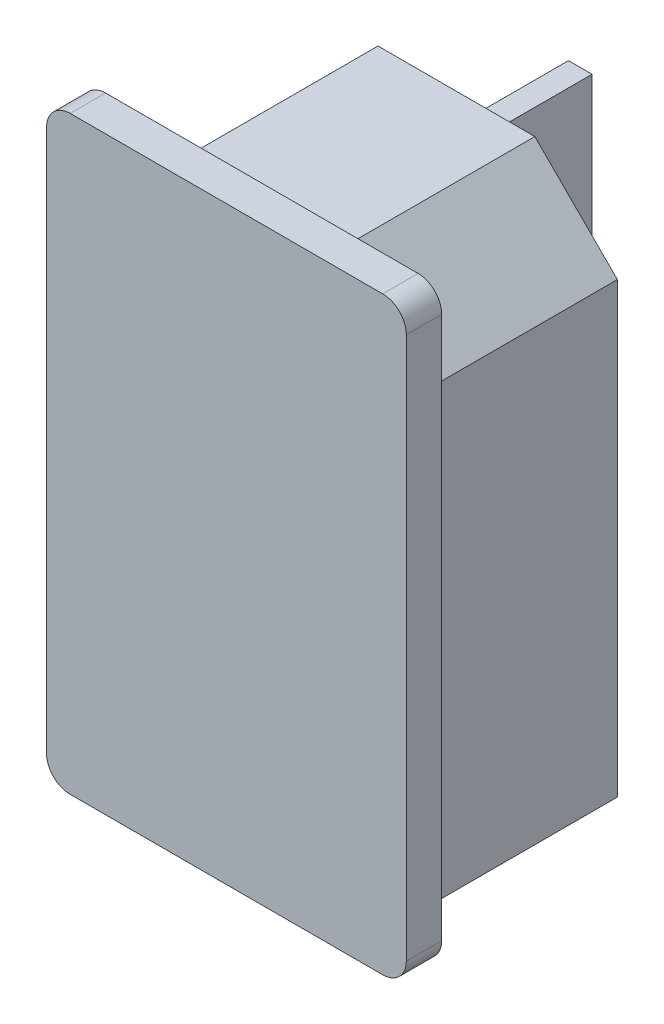
ISO-10303-21;
HEADER;
FILE_DESCRIPTION(('STEP AP214'),'2;1');
FILE_NAME('part.step','',(''),(''),'','','');
FILE_SCHEMA(('AUTOMOTIVE_DESIGN { 1 0 10303 214 1 1 1 1 }'));
ENDSEC;
DATA;
#1=APPLICATION_CONTEXT('core data for automotive mechanical design processes');
#2=APPLICATION_PROTOCOL_DEFINITION('international standard','automotive_design',2000,#1);
#3=PRODUCT_CONTEXT('',#1,'mechanical');
#4=PRODUCT('Part','Part','',(#3));
#5=PRODUCT_RELATED_PRODUCT_CATEGORY('part','',(#4));
#6=PRODUCT_DEFINITION_FORMATION('','',#4);
#7=PRODUCT_DEFINITION_CONTEXT('part definition',#1,'design');
#8=PRODUCT_DEFINITION('design','',#6,#7);
#9=PRODUCT_DEFINITION_SHAPE('','',#8);
#10=(LENGTH_UNIT() NAMED_UNIT(*) SI_UNIT(.MILLI.,.METRE.));
#11=(NAMED_UNIT(*) PLANE_ANGLE_UNIT() SI_UNIT($,.RADIAN.));
#12=(NAMED_UNIT(*) SI_UNIT($,.STERADIAN.) SOLID_ANGLE_UNIT());
#13=UNCERTAINTY_MEASURE_WITH_UNIT(LENGTH_MEASURE(1.E-05),#10,'distance_accuracy_value','');
#14=(GEOMETRIC_REPRESENTATION_CONTEXT(3) GLOBAL_UNCERTAINTY_ASSIGNED_CONTEXT((#13)) GLOBAL_UNIT_ASSIGNED_CONTEXT((#10,
#11,#12)) REPRESENTATION_CONTEXT('',''));
#15=CARTESIAN_POINT('',(0.,0.,0.));
#16=DIRECTION('',(0.,0.,1.));
#17=DIRECTION('',(1.,0.,0.));
#18=AXIS2_PLACEMENT_3D('',#15,#16,#17);
#19=CARTESIAN_POINT('',(0.,0.,-19.5));
#20=DIRECTION('',(0.,0.,-1.));
#21=DIRECTION('',(-1.,0.,0.));
#22=AXIS2_PLACEMENT_3D('',#19,#20,#21);
#23=PLANE('',#22);
#24=DIRECTION('',(0.,-1.,0.));
#25=VECTOR('',#24,1.);
#26=CARTESIAN_POINT('',(13.65,16.5,-19.5));
#27=LINE('',#26,#25);
#28=CARTESIAN_POINT('',(13.65,16.5,-19.5));
#29=VERTEX_POINT('',#28);
#30=CARTESIAN_POINT('',(13.65,-21.5,-19.5));
#31=VERTEX_POINT('',#30);
#32=EDGE_CURVE('E217',#29,#31,#27,.T.);
#33=ORIENTED_EDGE('',*,*,#32,.T.);
#34=DIRECTION('',(0.707106781186548,0.707106781186548,0.));
#35=VECTOR('',#34,1.);
#36=CARTESIAN_POINT('',(17.575,-17.575,-19.5));
#37=LINE('',#36,#35);
#38=CARTESIAN_POINT('',(11.65,-23.5,-19.5));
#39=VERTEX_POINT('',#38);
#40=EDGE_CURVE('E318',#31,#39,#37,.F.);
#41=ORIENTED_EDGE('',*,*,#40,.T.);
#42=DIRECTION('',(-1.,0.,0.));
#43=VECTOR('',#42,1.);
#44=CARTESIAN_POINT('',(13.65,-23.5,-19.5));
#45=LINE('',#44,#43);
#46=CARTESIAN_POINT('',(-11.65,-23.5,-19.5));
#47=VERTEX_POINT('',#46);
#48=EDGE_CURVE('E220',#39,#47,#45,.T.);
#49=ORIENTED_EDGE('',*,*,#48,.T.);
#50=DIRECTION('',(0.707106781186548,-0.707106781186547,0.));
#51=VECTOR('',#50,1.);
#52=CARTESIAN_POINT('',(-17.575,-17.575,-19.5));
#53=LINE('',#52,#51);
#54=CARTESIAN_POINT('',(-13.65,-21.5,-19.5));
#55=VERTEX_POINT('',#54);
#56=EDGE_CURVE('E316',#47,#55,#53,.F.);
#57=ORIENTED_EDGE('',*,*,#56,.T.);
#58=DIRECTION('',(0.,1.,0.));
#59=VECTOR('',#58,1.);
#60=CARTESIAN_POINT('',(-13.65,16.5,-19.5));
#61=LINE('',#60,#59);
#62=CARTESIAN_POINT('',(-13.65,16.5,-19.5));
#63=VERTEX_POINT('',#62);
#64=EDGE_CURVE('E208',#55,#63,#61,.T.);
#65=ORIENTED_EDGE('',*,*,#64,.T.);
#66=DIRECTION('',(0.707106781186548,0.707106781186547,0.));
#67=VECTOR('',#66,1.);
#68=CARTESIAN_POINT('',(-13.65,16.5,-19.5));
#69=LINE('',#68,#67);
#70=CARTESIAN_POINT('',(-6.65,23.5,-19.5));
#71=VERTEX_POINT('',#70);
#72=EDGE_CURVE('E210',#63,#71,#69,.T.);
#73=ORIENTED_EDGE('',*,*,#72,.T.);
#74=DIRECTION('',(1.,0.,0.));
#75=VECTOR('',#74,1.);
#76=CARTESIAN_POINT('',(6.65,23.5,-19.5));
#77=LINE('',#76,#75);
#78=CARTESIAN_POINT('',(6.65,23.5,-19.5));
#79=VERTEX_POINT('',#78);
#80=EDGE_CURVE('E213',#71,#79,#77,.T.);
#81=ORIENTED_EDGE('',*,*,#80,.T.);
#82=DIRECTION('',(0.707106781186548,-0.707106781186548,0.));
#83=VECTOR('',#82,1.);
#84=CARTESIAN_POINT('',(13.65,16.5,-19.5));
#85=LINE('',#84,#83);
#86=EDGE_CURVE('E215',#79,#29,#85,.T.);
#87=ORIENTED_EDGE('',*,*,#86,.T.);
#88=EDGE_LOOP('',(#33,#41,#49,#57,#65,#73,#81,#87));
#89=FACE_BOUND('',#88,.T.);
#90=DIRECTION('',(-1.,0.,0.));
#91=VECTOR('',#90,1.);
#92=CARTESIAN_POINT('',(1.,-20.,-19.5));
#93=LINE('',#92,#91);
#94=CARTESIAN_POINT('',(1.,-20.,-19.5));
#95=VERTEX_POINT('',#94);
#96=CARTESIAN_POINT('',(-1.,-20.,-19.5));
#97=VERTEX_POINT('',#96);
#98=EDGE_CURVE('E204',#95,#97,#93,.T.);
#99=ORIENTED_EDGE('',*,*,#98,.F.);
#100=DIRECTION('',(0.,-1.,0.));
#101=VECTOR('',#100,1.);
#102=CARTESIAN_POINT('',(1.,20.,-19.5));
#103=LINE('',#102,#101);
#104=CARTESIAN_POINT('',(1.,20.,-19.5));
#105=VERTEX_POINT('',#104);
#106=EDGE_CURVE('E198',#105,#95,#103,.T.);
#107=ORIENTED_EDGE('',*,*,#106,.F.);
#108=DIRECTION('',(1.,0.,0.));
#109=VECTOR('',#108,1.);
#110=CARTESIAN_POINT('',(1.,20.,-19.5));
#111=LINE('',#110,#109);
#112=CARTESIAN_POINT('',(-1.,20.,-19.5));
#113=VERTEX_POINT('',#112);
#114=EDGE_CURVE('E178',#113,#105,#111,.T.);
#115=ORIENTED_EDGE('',*,*,#114,.F.);
#116=DIRECTION('',(0.,1.,0.));
#117=VECTOR('',#116,1.);
#118=CARTESIAN_POINT('',(-1.,20.,-19.5));
#119=LINE('',#118,#117);
#120=EDGE_CURVE('E51',#97,#113,#119,.T.);
#121=ORIENTED_EDGE('',*,*,#120,.F.);
#122=EDGE_LOOP('',(#99,#107,#115,#121));
#123=FACE_BOUND('',#122,.T.);
#124=ADVANCED_FACE('F36',(#89,#123),#23,.T.);
#125=CARTESIAN_POINT('',(13.25,23.,-3.));
#126=DIRECTION('',(0.,0.,-1.));
#127=DIRECTION('',(-1.,0.,0.));
#128=AXIS2_PLACEMENT_3D('',#125,#126,#127);
#129=PLANE('',#128);
#130=CARTESIAN_POINT('',(13.25,23.,-3.));
#131=DIRECTION('',(0.,0.,1.));
#132=DIRECTION('',(-1.,0.,0.));
#133=AXIS2_PLACEMENT_3D('',#130,#131,#132);
#134=CIRCLE('',#133,2.);
#135=CARTESIAN_POINT('',(15.25,23.,-3.));
#136=VERTEX_POINT('',#135);
#137=CARTESIAN_POINT('',(13.25,25.,-3.));
#138=VERTEX_POINT('',#137);
#139=EDGE_CURVE('E246',#136,#138,#134,.T.);
#140=ORIENTED_EDGE('',*,*,#139,.F.);
#141=DIRECTION('',(0.,1.,0.));
#142=VECTOR('',#141,1.);
#143=CARTESIAN_POINT('',(15.25,23.,-3.));
#144=LINE('',#143,#142);
#145=CARTESIAN_POINT('',(15.25,-23.,-3.));
#146=VERTEX_POINT('',#145);
#147=EDGE_CURVE('E268',#146,#136,#144,.T.);
#148=ORIENTED_EDGE('',*,*,#147,.F.);
#149=CARTESIAN_POINT('',(13.25,-23.,-3.));
#150=DIRECTION('',(0.,0.,1.));
#151=DIRECTION('',(1.,0.,0.));
#152=AXIS2_PLACEMENT_3D('',#149,#150,#151);
#153=CIRCLE('',#152,2.);
#154=CARTESIAN_POINT('',(13.25,-25.,-3.));
#155=VERTEX_POINT('',#154);
#156=EDGE_CURVE('E265',#155,#146,#153,.T.);
#157=ORIENTED_EDGE('',*,*,#156,.F.);
#158=DIRECTION('',(1.,0.,0.));
#159=VECTOR('',#158,1.);
#160=CARTESIAN_POINT('',(-13.25,-25.,-3.));
#161=LINE('',#160,#159);
#162=CARTESIAN_POINT('',(-13.25,-25.,-3.));
#163=VERTEX_POINT('',#162);
#164=EDGE_CURVE('E262',#163,#155,#161,.T.);
#165=ORIENTED_EDGE('',*,*,#164,.F.);
#166=CARTESIAN_POINT('',(-13.25,-23.,-3.));
#167=DIRECTION('',(0.,0.,1.));
#168=DIRECTION('',(1.,0.,0.));
#169=AXIS2_PLACEMENT_3D('',#166,#167,#168);
#170=CIRCLE('',#169,2.);
#171=CARTESIAN_POINT('',(-15.25,-23.,-3.));
#172=VERTEX_POINT('',#171);
#173=EDGE_CURVE('E259',#172,#163,#170,.T.);
#174=ORIENTED_EDGE('',*,*,#173,.F.);
#175=DIRECTION('',(0.,-1.,0.));
#176=VECTOR('',#175,1.);
#177=CARTESIAN_POINT('',(-15.25,23.,-3.));
#178=LINE('',#177,#176);
#179=CARTESIAN_POINT('',(-15.25,23.,-3.));
#180=VERTEX_POINT('',#179);
#181=EDGE_CURVE('E256',#180,#172,#178,.T.);
#182=ORIENTED_EDGE('',*,*,#181,.F.);
#183=CARTESIAN_POINT('',(-13.25,23.,-3.));
#184=DIRECTION('',(0.,0.,1.));
#185=DIRECTION('',(1.,0.,0.));
#186=AXIS2_PLACEMENT_3D('',#183,#184,#185);
#187=CIRCLE('',#186,2.);
#188=CARTESIAN_POINT('',(-13.25,25.,-3.));
#189=VERTEX_POINT('',#188);
#190=EDGE_CURVE('E253',#189,#180,#187,.T.);
#191=ORIENTED_EDGE('',*,*,#190,.F.);
#192=DIRECTION('',(-1.,0.,0.));
#193=VECTOR('',#192,1.);
#194=CARTESIAN_POINT('',(-13.25,25.,-3.));
#195=LINE('',#194,#193);
#196=EDGE_CURVE('E249',#138,#189,#195,.T.);
#197=ORIENTED_EDGE('',*,*,#196,.F.);
#198=EDGE_LOOP('',(#140,#148,#157,#165,#174,#182,#191,#197));
#199=FACE_BOUND('',#198,.T.);
#200=DIRECTION('',(0.707106781186548,0.707106781186547,0.));
#201=VECTOR('',#200,1.);
#202=CARTESIAN_POINT('',(-13.65,16.5,-3.));
#203=LINE('',#202,#201);
#204=CARTESIAN_POINT('',(-13.65,16.5,-3.));
#205=VERTEX_POINT('',#204);
#206=CARTESIAN_POINT('',(-6.65,23.5,-3.));
#207=VERTEX_POINT('',#206);
#208=EDGE_CURVE('E194',#205,#207,#203,.T.);
#209=ORIENTED_EDGE('',*,*,#208,.F.);
#210=DIRECTION('',(0.,1.,0.));
#211=VECTOR('',#210,1.);
#212=CARTESIAN_POINT('',(-13.65,16.5,-3.));
#213=LINE('',#212,#211);
#214=CARTESIAN_POINT('',(-13.65,-21.5,-3.));
#215=VERTEX_POINT('',#214);
#216=EDGE_CURVE('E192',#215,#205,#213,.T.);
#217=ORIENTED_EDGE('',*,*,#216,.F.);
#218=DIRECTION('',(-0.707106781186548,0.707106781186547,0.));
#219=VECTOR('',#218,1.);
#220=CARTESIAN_POINT('',(-13.65,-21.5,-3.));
#221=LINE('',#220,#219);
#222=CARTESIAN_POINT('',(-11.65,-23.5,-3.));
#223=VERTEX_POINT('',#222);
#224=EDGE_CURVE('E12',#215,#223,#221,.F.);
#225=ORIENTED_EDGE('',*,*,#224,.T.);
#226=DIRECTION('',(-1.,0.,0.));
#227=VECTOR('',#226,1.);
#228=CARTESIAN_POINT('',(13.65,-23.5,-3.));
#229=LINE('',#228,#227);
#230=CARTESIAN_POINT('',(11.65,-23.5,-3.));
#231=VERTEX_POINT('',#230);
#232=EDGE_CURVE('E211',#231,#223,#229,.T.);
#233=ORIENTED_EDGE('',*,*,#232,.F.);
#234=DIRECTION('',(-0.707106781186548,-0.707106781186548,0.));
#235=VECTOR('',#234,1.);
#236=CARTESIAN_POINT('',(11.65,-23.5,-3.));
#237=LINE('',#236,#235);
#238=CARTESIAN_POINT('',(13.65,-21.5,-3.));
#239=VERTEX_POINT('',#238);
#240=EDGE_CURVE('E44',#231,#239,#237,.F.);
#241=ORIENTED_EDGE('',*,*,#240,.T.);
#242=DIRECTION('',(0.,-1.,0.));
#243=VECTOR('',#242,1.);
#244=CARTESIAN_POINT('',(13.65,16.5,-3.));
#245=LINE('',#244,#243);
#246=CARTESIAN_POINT('',(13.65,16.5,-3.));
#247=VERTEX_POINT('',#246);
#248=EDGE_CURVE('E229',#247,#239,#245,.T.);
#249=ORIENTED_EDGE('',*,*,#248,.F.);
#250=DIRECTION('',(0.707106781186548,-0.707106781186548,0.));
#251=VECTOR('',#250,1.);
#252=CARTESIAN_POINT('',(13.65,16.5,-3.));
#253=LINE('',#252,#251);
#254=CARTESIAN_POINT('',(6.65,23.5,-3.));
#255=VERTEX_POINT('',#254);
#256=EDGE_CURVE('E227',#255,#247,#253,.T.);
#257=ORIENTED_EDGE('',*,*,#256,.F.);
#258=DIRECTION('',(1.,0.,0.));
#259=VECTOR('',#258,1.);
#260=CARTESIAN_POINT('',(6.65,23.5,-3.));
#261=LINE('',#260,#259);
#262=EDGE_CURVE('E225',#207,#255,#261,.T.);
#263=ORIENTED_EDGE('',*,*,#262,.F.);
#264=EDGE_LOOP('',(#209,#217,#225,#233,#241,#249,#257,#263));
#265=FACE_BOUND('',#264,.T.);
#266=ADVANCED_FACE('F325',(#199,#265),#129,.T.);
#267=CARTESIAN_POINT('',(13.25,23.,-3.));
#268=DIRECTION('',(0.,0.,1.));
#269=DIRECTION('',(1.,0.,0.));
#270=AXIS2_PLACEMENT_3D('',#267,#268,#269);
#271=CYLINDRICAL_SURFACE('',#270,2.);
#272=CARTESIAN_POINT('',(13.25,23.,0.));
#273=DIRECTION('',(0.,0.,1.));
#274=DIRECTION('',(-1.,0.,0.));
#275=AXIS2_PLACEMENT_3D('',#272,#273,#274);
#276=CIRCLE('',#275,2.);
#277=CARTESIAN_POINT('',(15.25,23.,0.));
#278=VERTEX_POINT('',#277);
#279=CARTESIAN_POINT('',(13.25,25.,0.));
#280=VERTEX_POINT('',#279);
#281=EDGE_CURVE('E245',#278,#280,#276,.T.);
#282=ORIENTED_EDGE('',*,*,#281,.F.);
#283=DIRECTION('',(0.,0.,1.));
#284=VECTOR('',#283,1.);
#285=CARTESIAN_POINT('',(15.25,23.,-3.));
#286=LINE('',#285,#284);
#287=EDGE_CURVE('E294',#136,#278,#286,.T.);
#288=ORIENTED_EDGE('',*,*,#287,.F.);
#289=ORIENTED_EDGE('',*,*,#139,.T.);
#290=DIRECTION('',(0.,0.,1.));
#291=VECTOR('',#290,1.);
#292=CARTESIAN_POINT('',(13.25,25.,-3.));
#293=LINE('',#292,#291);
#294=EDGE_CURVE('E271',#138,#280,#293,.T.);
#295=ORIENTED_EDGE('',*,*,#294,.T.);
#296=EDGE_LOOP('',(#282,#288,#289,#295));
#297=FACE_BOUND('',#296,.T.);
#298=ADVANCED_FACE('F372',(#297),#271,.T.);
#299=CARTESIAN_POINT('',(15.25,23.,-3.));
#300=DIRECTION('',(1.,0.,0.));
#301=DIRECTION('',(0.,0.,-1.));
#302=AXIS2_PLACEMENT_3D('',#299,#300,#301);
#303=PLANE('',#302);
#304=DIRECTION('',(0.,1.,0.));
#305=VECTOR('',#304,1.);
#306=CARTESIAN_POINT('',(15.25,23.,0.));
#307=LINE('',#306,#305);
#308=CARTESIAN_POINT('',(15.25,-23.,0.));
#309=VERTEX_POINT('',#308);
#310=EDGE_CURVE('E250',#309,#278,#307,.T.);
#311=ORIENTED_EDGE('',*,*,#310,.F.);
#312=DIRECTION('',(0.,0.,1.));
#313=VECTOR('',#312,1.);
#314=CARTESIAN_POINT('',(15.25,-23.,-3.));
#315=LINE('',#314,#313);
#316=EDGE_CURVE('E297',#146,#309,#315,.T.);
#317=ORIENTED_EDGE('',*,*,#316,.F.);
#318=ORIENTED_EDGE('',*,*,#147,.T.);
#319=ORIENTED_EDGE('',*,*,#287,.T.);
#320=EDGE_LOOP('',(#311,#317,#318,#319));
#321=FACE_BOUND('',#320,.T.);
#322=ADVANCED_FACE('F389',(#321),#303,.T.);
#323=CARTESIAN_POINT('',(13.25,-23.,-3.));
#324=DIRECTION('',(0.,0.,1.));
#325=DIRECTION('',(1.,0.,0.));
#326=AXIS2_PLACEMENT_3D('',#323,#324,#325);
#327=CYLINDRICAL_SURFACE('',#326,2.);
#328=CARTESIAN_POINT('',(13.25,-23.,0.));
#329=DIRECTION('',(0.,0.,1.));
#330=DIRECTION('',(1.,0.,0.));
#331=AXIS2_PLACEMENT_3D('',#328,#329,#330);
#332=CIRCLE('',#331,2.);
#333=CARTESIAN_POINT('',(13.25,-25.,0.));
#334=VERTEX_POINT('',#333);
#335=EDGE_CURVE('E289',#334,#309,#332,.T.);
#336=ORIENTED_EDGE('',*,*,#335,.F.);
#337=DIRECTION('',(0.,0.,1.));
#338=VECTOR('',#337,1.);
#339=CARTESIAN_POINT('',(13.25,-25.,-3.));
#340=LINE('',#339,#338);
#341=EDGE_CURVE('E299',#155,#334,#340,.T.);
#342=ORIENTED_EDGE('',*,*,#341,.F.);
#343=ORIENTED_EDGE('',*,*,#156,.T.);
#344=ORIENTED_EDGE('',*,*,#316,.T.);
#345=EDGE_LOOP('',(#336,#342,#343,#344));
#346=FACE_BOUND('',#345,.T.);
#347=ADVANCED_FACE('F411',(#346),#327,.T.);
#348=CARTESIAN_POINT('',(-13.25,-25.,-3.));
#349=DIRECTION('',(0.,-1.,0.));
#350=DIRECTION('',(1.,0.,0.));
#351=AXIS2_PLACEMENT_3D('',#348,#349,#350);
#352=PLANE('',#351);
#353=DIRECTION('',(1.,0.,0.));
#354=VECTOR('',#353,1.);
#355=CARTESIAN_POINT('',(-13.25,-25.,0.));
#356=LINE('',#355,#354);
#357=CARTESIAN_POINT('',(-13.25,-25.,0.));
#358=VERTEX_POINT('',#357);
#359=EDGE_CURVE('E286',#358,#334,#356,.T.);
#360=ORIENTED_EDGE('',*,*,#359,.F.);
#361=DIRECTION('',(0.,0.,1.));
#362=VECTOR('',#361,1.);
#363=CARTESIAN_POINT('',(-13.25,-25.,-3.));
#364=LINE('',#363,#362);
#365=EDGE_CURVE('E301',#163,#358,#364,.T.);
#366=ORIENTED_EDGE('',*,*,#365,.F.);
#367=ORIENTED_EDGE('',*,*,#164,.T.);
#368=ORIENTED_EDGE('',*,*,#341,.T.);
#369=EDGE_LOOP('',(#360,#366,#367,#368));
#370=FACE_BOUND('',#369,.T.);
#371=ADVANCED_FACE('F407',(#370),#352,.T.);
#372=CARTESIAN_POINT('',(-13.25,-23.,-3.));
#373=DIRECTION('',(0.,0.,1.));
#374=DIRECTION('',(1.,0.,0.));
#375=AXIS2_PLACEMENT_3D('',#372,#373,#374);
#376=CYLINDRICAL_SURFACE('',#375,2.);
#377=CARTESIAN_POINT('',(-13.25,-23.,0.));
#378=DIRECTION('',(0.,0.,1.));
#379=DIRECTION('',(1.,0.,0.));
#380=AXIS2_PLACEMENT_3D('',#377,#378,#379);
#381=CIRCLE('',#380,2.);
#382=CARTESIAN_POINT('',(-15.25,-23.,0.));
#383=VERTEX_POINT('',#382);
#384=EDGE_CURVE('E283',#383,#358,#381,.T.);
#385=ORIENTED_EDGE('',*,*,#384,.F.);
#386=DIRECTION('',(0.,0.,1.));
#387=VECTOR('',#386,1.);
#388=CARTESIAN_POINT('',(-15.25,-23.,-3.));
#389=LINE('',#388,#387);
#390=EDGE_CURVE('E303',#172,#383,#389,.T.);
#391=ORIENTED_EDGE('',*,*,#390,.F.);
#392=ORIENTED_EDGE('',*,*,#173,.T.);
#393=ORIENTED_EDGE('',*,*,#365,.T.);
#394=EDGE_LOOP('',(#385,#391,#392,#393));
#395=FACE_BOUND('',#394,.T.);
#396=ADVANCED_FACE('F403',(#395),#376,.T.);
#397=CARTESIAN_POINT('',(-15.25,23.,-3.));
#398=DIRECTION('',(-1.,0.,0.));
#399=DIRECTION('',(0.,0.,1.));
#400=AXIS2_PLACEMENT_3D('',#397,#398,#399);
#401=PLANE('',#400);
#402=DIRECTION('',(0.,-1.,0.));
#403=VECTOR('',#402,1.);
#404=CARTESIAN_POINT('',(-15.25,23.,0.));
#405=LINE('',#404,#403);
#406=CARTESIAN_POINT('',(-15.25,23.,0.));
#407=VERTEX_POINT('',#406);
#408=EDGE_CURVE('E280',#407,#383,#405,.T.);
#409=ORIENTED_EDGE('',*,*,#408,.F.);
#410=DIRECTION('',(0.,0.,1.));
#411=VECTOR('',#410,1.);
#412=CARTESIAN_POINT('',(-15.25,23.,-3.));
#413=LINE('',#412,#411);
#414=EDGE_CURVE('E305',#180,#407,#413,.T.);
#415=ORIENTED_EDGE('',*,*,#414,.F.);
#416=ORIENTED_EDGE('',*,*,#181,.T.);
#417=ORIENTED_EDGE('',*,*,#390,.T.);
#418=EDGE_LOOP('',(#409,#415,#416,#417));
#419=FACE_BOUND('',#418,.T.);
#420=ADVANCED_FACE('F399',(#419),#401,.T.);
#421=CARTESIAN_POINT('',(-13.25,23.,-3.));
#422=DIRECTION('',(0.,0.,1.));
#423=DIRECTION('',(1.,0.,0.));
#424=AXIS2_PLACEMENT_3D('',#421,#422,#423);
#425=CYLINDRICAL_SURFACE('',#424,2.);
#426=CARTESIAN_POINT('',(-13.25,23.,0.));
#427=DIRECTION('',(0.,0.,1.));
#428=DIRECTION('',(1.,0.,0.));
#429=AXIS2_PLACEMENT_3D('',#426,#427,#428);
#430=CIRCLE('',#429,2.);
#431=CARTESIAN_POINT('',(-13.25,25.,0.));
#432=VERTEX_POINT('',#431);
#433=EDGE_CURVE('E277',#432,#407,#430,.T.);
#434=ORIENTED_EDGE('',*,*,#433,.F.);
#435=DIRECTION('',(0.,0.,1.));
#436=VECTOR('',#435,1.);
#437=CARTESIAN_POINT('',(-13.25,25.,-3.));
#438=LINE('',#437,#436);
#439=EDGE_CURVE('E307',#189,#432,#438,.T.);
#440=ORIENTED_EDGE('',*,*,#439,.F.);
#441=ORIENTED_EDGE('',*,*,#190,.T.);
#442=ORIENTED_EDGE('',*,*,#414,.T.);
#443=EDGE_LOOP('',(#434,#440,#441,#442));
#444=FACE_BOUND('',#443,.T.);
#445=ADVANCED_FACE('F395',(#444),#425,.T.);
#446=CARTESIAN_POINT('',(-13.25,25.,-3.));
#447=DIRECTION('',(0.,1.,0.));
#448=DIRECTION('',(-1.,0.,0.));
#449=AXIS2_PLACEMENT_3D('',#446,#447,#448);
#450=PLANE('',#449);
#451=DIRECTION('',(-1.,0.,0.));
#452=VECTOR('',#451,1.);
#453=CARTESIAN_POINT('',(-13.25,25.,0.));
#454=LINE('',#453,#452);
#455=EDGE_CURVE('E274',#280,#432,#454,.T.);
#456=ORIENTED_EDGE('',*,*,#455,.F.);
#457=ORIENTED_EDGE('',*,*,#294,.F.);
#458=ORIENTED_EDGE('',*,*,#196,.T.);
#459=ORIENTED_EDGE('',*,*,#439,.T.);
#460=EDGE_LOOP('',(#456,#457,#458,#459));
#461=FACE_BOUND('',#460,.T.);
#462=ADVANCED_FACE('F391',(#461),#450,.T.);
#463=CARTESIAN_POINT('',(13.25,23.,0.));
#464=DIRECTION('',(0.,0.,-1.));
#465=DIRECTION('',(-1.,0.,0.));
#466=AXIS2_PLACEMENT_3D('',#463,#464,#465);
#467=PLANE('',#466);
#468=ORIENTED_EDGE('',*,*,#281,.T.);
#469=ORIENTED_EDGE('',*,*,#455,.T.);
#470=ORIENTED_EDGE('',*,*,#433,.T.);
#471=ORIENTED_EDGE('',*,*,#408,.T.);
#472=ORIENTED_EDGE('',*,*,#384,.T.);
#473=ORIENTED_EDGE('',*,*,#359,.T.);
#474=ORIENTED_EDGE('',*,*,#335,.T.);
#475=ORIENTED_EDGE('',*,*,#310,.T.);
#476=EDGE_LOOP('',(#468,#469,#470,#471,#472,#473,#474,#475));
#477=FACE_BOUND('',#476,.T.);
#478=ADVANCED_FACE('F394',(#477),#467,.F.);
#479=CARTESIAN_POINT('',(-13.65,16.5,-19.5));
#480=DIRECTION('',(1.,0.,0.));
#481=DIRECTION('',(0.,1.,0.));
#482=AXIS2_PLACEMENT_3D('',#479,#480,#481);
#483=PLANE('',#482);
#484=ORIENTED_EDGE('',*,*,#64,.F.);
#485=DIRECTION('',(0.,0.,1.));
#486=VECTOR('',#485,1.);
#487=CARTESIAN_POINT('',(-13.65,-21.5,-19.5));
#488=LINE('',#487,#486);
#489=EDGE_CURVE('E320',#55,#215,#488,.T.);
#490=ORIENTED_EDGE('',*,*,#489,.T.);
#491=ORIENTED_EDGE('',*,*,#216,.T.);
#492=DIRECTION('',(0.,0.,1.));
#493=VECTOR('',#492,1.);
#494=CARTESIAN_POINT('',(-13.65,16.5,-19.5));
#495=LINE('',#494,#493);
#496=EDGE_CURVE('E242',#63,#205,#495,.T.);
#497=ORIENTED_EDGE('',*,*,#496,.F.);
#498=EDGE_LOOP('',(#484,#490,#491,#497));
#499=FACE_BOUND('',#498,.T.);
#500=ADVANCED_FACE('F346',(#499),#483,.F.);
#501=CARTESIAN_POINT('',(-13.65,16.5,-19.5));
#502=DIRECTION('',(0.707106781186547,-0.707106781186548,0.));
#503=DIRECTION('',(0.707106781186548,0.707106781186547,0.));
#504=AXIS2_PLACEMENT_3D('',#501,#502,#503);
#505=PLANE('',#504);
#506=ORIENTED_EDGE('',*,*,#208,.T.);
#507=DIRECTION('',(0.,0.,1.));
#508=VECTOR('',#507,1.);
#509=CARTESIAN_POINT('',(-6.65,23.5,-19.5));
#510=LINE('',#509,#508);
#511=EDGE_CURVE('E239',#71,#207,#510,.T.);
#512=ORIENTED_EDGE('',*,*,#511,.F.);
#513=ORIENTED_EDGE('',*,*,#72,.F.);
#514=ORIENTED_EDGE('',*,*,#496,.T.);
#515=EDGE_LOOP('',(#506,#512,#513,#514));
#516=FACE_BOUND('',#515,.T.);
#517=ADVANCED_FACE('F349',(#516),#505,.F.);
#518=CARTESIAN_POINT('',(6.65,23.5,-19.5));
#519=DIRECTION('',(0.,-1.,0.));
#520=DIRECTION('',(0.,0.,-1.));
#521=AXIS2_PLACEMENT_3D('',#518,#519,#520);
#522=PLANE('',#521);
#523=ORIENTED_EDGE('',*,*,#262,.T.);
#524=DIRECTION('',(0.,0.,1.));
#525=VECTOR('',#524,1.);
#526=CARTESIAN_POINT('',(6.65,23.5,-19.5));
#527=LINE('',#526,#525);
#528=EDGE_CURVE('E236',#79,#255,#527,.T.);
#529=ORIENTED_EDGE('',*,*,#528,.F.);
#530=ORIENTED_EDGE('',*,*,#80,.F.);
#531=ORIENTED_EDGE('',*,*,#511,.T.);
#532=EDGE_LOOP('',(#523,#529,#530,#531));
#533=FACE_BOUND('',#532,.T.);
#534=ADVANCED_FACE('F354',(#533),#522,.F.);
#535=CARTESIAN_POINT('',(13.65,16.5,-19.5));
#536=DIRECTION('',(-0.707106781186547,-0.707106781186547,0.));
#537=DIRECTION('',(0.707106781186548,-0.707106781186548,0.));
#538=AXIS2_PLACEMENT_3D('',#535,#536,#537);
#539=PLANE('',#538);
#540=ORIENTED_EDGE('',*,*,#256,.T.);
#541=DIRECTION('',(0.,0.,1.));
#542=VECTOR('',#541,1.);
#543=CARTESIAN_POINT('',(13.65,16.5,-19.5));
#544=LINE('',#543,#542);
#545=EDGE_CURVE('E222',#29,#247,#544,.T.);
#546=ORIENTED_EDGE('',*,*,#545,.F.);
#547=ORIENTED_EDGE('',*,*,#86,.F.);
#548=ORIENTED_EDGE('',*,*,#528,.T.);
#549=EDGE_LOOP('',(#540,#546,#547,#548));
#550=FACE_BOUND('',#549,.T.);
#551=ADVANCED_FACE('F358',(#550),#539,.F.);
#552=CARTESIAN_POINT('',(13.65,16.5,-19.5));
#553=DIRECTION('',(-1.,0.,0.));
#554=DIRECTION('',(0.,-1.,0.));
#555=AXIS2_PLACEMENT_3D('',#552,#553,#554);
#556=PLANE('',#555);
#557=ORIENTED_EDGE('',*,*,#248,.T.);
#558=DIRECTION('',(0.,0.,-1.));
#559=VECTOR('',#558,1.);
#560=CARTESIAN_POINT('',(13.65,-21.5,-19.5));
#561=LINE('',#560,#559);
#562=EDGE_CURVE('E314',#239,#31,#561,.T.);
#563=ORIENTED_EDGE('',*,*,#562,.T.);
#564=ORIENTED_EDGE('',*,*,#32,.F.);
#565=ORIENTED_EDGE('',*,*,#545,.T.);
#566=EDGE_LOOP('',(#557,#563,#564,#565));
#567=FACE_BOUND('',#566,.T.);
#568=ADVANCED_FACE('F331',(#567),#556,.F.);
#569=CARTESIAN_POINT('',(13.65,-23.5,-19.5));
#570=DIRECTION('',(0.,1.,0.));
#571=DIRECTION('',(-1.,0.,0.));
#572=AXIS2_PLACEMENT_3D('',#569,#570,#571);
#573=PLANE('',#572);
#574=ORIENTED_EDGE('',*,*,#48,.F.);
#575=DIRECTION('',(0.,0.,1.));
#576=VECTOR('',#575,1.);
#577=CARTESIAN_POINT('',(11.65,-23.5,-19.5));
#578=LINE('',#577,#576);
#579=EDGE_CURVE('E311',#39,#231,#578,.T.);
#580=ORIENTED_EDGE('',*,*,#579,.T.);
#581=ORIENTED_EDGE('',*,*,#232,.T.);
#582=DIRECTION('',(0.,0.,-1.));
#583=VECTOR('',#582,1.);
#584=CARTESIAN_POINT('',(-11.65,-23.5,-19.5));
#585=LINE('',#584,#583);
#586=EDGE_CURVE('E296',#223,#47,#585,.T.);
#587=ORIENTED_EDGE('',*,*,#586,.T.);
#588=EDGE_LOOP('',(#574,#580,#581,#587));
#589=FACE_BOUND('',#588,.T.);
#590=ADVANCED_FACE('F341',(#589),#573,.F.);
#591=CARTESIAN_POINT('',(11.65,-23.5,-19.5));
#592=DIRECTION('',(-0.707106781186547,0.707106781186547,0.));
#593=DIRECTION('',(0.,0.,1.));
#594=AXIS2_PLACEMENT_3D('',#591,#592,#593);
#595=PLANE('',#594);
#596=ORIENTED_EDGE('',*,*,#40,.F.);
#597=ORIENTED_EDGE('',*,*,#562,.F.);
#598=ORIENTED_EDGE('',*,*,#240,.F.);
#599=ORIENTED_EDGE('',*,*,#579,.F.);
#600=EDGE_LOOP('',(#596,#597,#598,#599));
#601=FACE_BOUND('',#600,.T.);
#602=ADVANCED_FACE('F335',(#601),#595,.F.);
#603=CARTESIAN_POINT('',(-13.65,-21.5,-19.5));
#604=DIRECTION('',(0.707106781186547,0.707106781186548,0.));
#605=DIRECTION('',(0.,0.,1.));
#606=AXIS2_PLACEMENT_3D('',#603,#604,#605);
#607=PLANE('',#606);
#608=ORIENTED_EDGE('',*,*,#56,.F.);
#609=ORIENTED_EDGE('',*,*,#586,.F.);
#610=ORIENTED_EDGE('',*,*,#224,.F.);
#611=ORIENTED_EDGE('',*,*,#489,.F.);
#612=EDGE_LOOP('',(#608,#609,#610,#611));
#613=FACE_BOUND('',#612,.T.);
#614=ADVANCED_FACE('F38',(#613),#607,.F.);
#615=CARTESIAN_POINT('',(1.,20.,-100.049968789002));
#616=DIRECTION('',(-1.,0.,0.));
#617=DIRECTION('',(0.,0.,1.));
#618=AXIS2_PLACEMENT_3D('',#615,#616,#617);
#619=PLANE('',#618);
#620=DIRECTION('',(0.,-1.,0.));
#621=VECTOR('',#620,1.);
#622=CARTESIAN_POINT('',(1.,20.,-30.));
#623=LINE('',#622,#621);
#624=CARTESIAN_POINT('',(1.,20.,-30.));
#625=VERTEX_POINT('',#624);
#626=CARTESIAN_POINT('',(1.,-20.,-30.));
#627=VERTEX_POINT('',#626);
#628=EDGE_CURVE('E187',#625,#627,#623,.T.);
#629=ORIENTED_EDGE('',*,*,#628,.F.);
#630=DIRECTION('',(0.,0.,1.));
#631=VECTOR('',#630,1.);
#632=CARTESIAN_POINT('',(1.,20.,-100.049968789002));
#633=LINE('',#632,#631);
#634=EDGE_CURVE('E183',#625,#105,#633,.T.);
#635=ORIENTED_EDGE('',*,*,#634,.T.);
#636=ORIENTED_EDGE('',*,*,#106,.T.);
#637=DIRECTION('',(0.,0.,1.));
#638=VECTOR('',#637,1.);
#639=CARTESIAN_POINT('',(1.,-20.,-100.049968789002));
#640=LINE('',#639,#638);
#641=EDGE_CURVE('E202',#627,#95,#640,.T.);
#642=ORIENTED_EDGE('',*,*,#641,.F.);
#643=EDGE_LOOP('',(#629,#635,#636,#642));
#644=FACE_BOUND('',#643,.T.);
#645=ADVANCED_FACE('F385',(#644),#619,.F.);
#646=CARTESIAN_POINT('',(1.,-20.,-100.049968789002));
#647=DIRECTION('',(0.,1.,0.));
#648=DIRECTION('',(0.,0.,1.));
#649=AXIS2_PLACEMENT_3D('',#646,#647,#648);
#650=PLANE('',#649);
#651=DIRECTION('',(-1.,0.,0.));
#652=VECTOR('',#651,1.);
#653=CARTESIAN_POINT('',(1.,-20.,-30.));
#654=LINE('',#653,#652);
#655=CARTESIAN_POINT('',(-1.,-20.,-30.));
#656=VERTEX_POINT('',#655);
#657=EDGE_CURVE('E191',#627,#656,#654,.T.);
#658=ORIENTED_EDGE('',*,*,#657,.F.);
#659=ORIENTED_EDGE('',*,*,#641,.T.);
#660=ORIENTED_EDGE('',*,*,#98,.T.);
#661=DIRECTION('',(0.,0.,1.));
#662=VECTOR('',#661,1.);
#663=CARTESIAN_POINT('',(-1.,-20.,-100.049968789002));
#664=LINE('',#663,#662);
#665=EDGE_CURVE('E205',#656,#97,#664,.T.);
#666=ORIENTED_EDGE('',*,*,#665,.F.);
#667=EDGE_LOOP('',(#658,#659,#660,#666));
#668=FACE_BOUND('',#667,.T.);
#669=ADVANCED_FACE('F482',(#668),#650,.F.);
#670=CARTESIAN_POINT('',(-1.,20.,-100.049968789002));
#671=DIRECTION('',(1.,0.,0.));
#672=DIRECTION('',(0.,0.,-1.));
#673=AXIS2_PLACEMENT_3D('',#670,#671,#672);
#674=PLANE('',#673);
#675=DIRECTION('',(0.,1.,0.));
#676=VECTOR('',#675,1.);
#677=CARTESIAN_POINT('',(-1.,20.,-30.));
#678=LINE('',#677,#676);
#679=CARTESIAN_POINT('',(-1.,20.,-30.));
#680=VERTEX_POINT('',#679);
#681=EDGE_CURVE('E173',#656,#680,#678,.T.);
#682=ORIENTED_EDGE('',*,*,#681,.F.);
#683=ORIENTED_EDGE('',*,*,#665,.T.);
#684=ORIENTED_EDGE('',*,*,#120,.T.);
#685=DIRECTION('',(0.,0.,1.));
#686=VECTOR('',#685,1.);
#687=CARTESIAN_POINT('',(-1.,20.,-100.049968789002));
#688=LINE('',#687,#686);
#689=EDGE_CURVE('E169',#680,#113,#688,.T.);
#690=ORIENTED_EDGE('',*,*,#689,.F.);
#691=EDGE_LOOP('',(#682,#683,#684,#690));
#692=FACE_BOUND('',#691,.T.);
#693=ADVANCED_FACE('F171',(#692),#674,.F.);
#694=CARTESIAN_POINT('',(1.,20.,-100.049968789002));
#695=DIRECTION('',(0.,-1.,0.));
#696=DIRECTION('',(0.,0.,-1.));
#697=AXIS2_PLACEMENT_3D('',#694,#695,#696);
#698=PLANE('',#697);
#699=DIRECTION('',(1.,0.,0.));
#700=VECTOR('',#699,1.);
#701=CARTESIAN_POINT('',(1.,20.,-30.));
#702=LINE('',#701,#700);
#703=EDGE_CURVE('E181',#680,#625,#702,.T.);
#704=ORIENTED_EDGE('',*,*,#703,.F.);
#705=ORIENTED_EDGE('',*,*,#689,.T.);
#706=ORIENTED_EDGE('',*,*,#114,.T.);
#707=ORIENTED_EDGE('',*,*,#634,.F.);
#708=EDGE_LOOP('',(#704,#705,#706,#707));
#709=FACE_BOUND('',#708,.T.);
#710=ADVANCED_FACE('F182',(#709),#698,.F.);
#711=CARTESIAN_POINT('',(13.25,23.,-30.));
#712=DIRECTION('',(0.,0.,-1.));
#713=DIRECTION('',(-1.,0.,0.));
#714=AXIS2_PLACEMENT_3D('',#711,#712,#713);
#715=PLANE('',#714);
#716=ORIENTED_EDGE('',*,*,#703,.T.);
#717=ORIENTED_EDGE('',*,*,#628,.T.);
#718=ORIENTED_EDGE('',*,*,#657,.T.);
#719=ORIENTED_EDGE('',*,*,#681,.T.);
#720=EDGE_LOOP('',(#716,#717,#718,#719));
#721=FACE_BOUND('',#720,.T.);
#722=ADVANCED_FACE('F190',(#721),#715,.T.);
#723=CLOSED_SHELL('',(#124,#266,#298,#322,#347,#371,#396,#420,#445,#462,#478,#500,#517,#534,
#551,#568,#590,#602,#614,#645,#669,#693,#710,#722));
#724=MANIFOLD_SOLID_BREP('B2',#723);
#725=ADVANCED_BREP_SHAPE_REPRESENTATION('',(#18,#724),#14);
#726=SHAPE_DEFINITION_REPRESENTATION(#9,#725);
ENDSEC;
END-ISO-10303-21;
